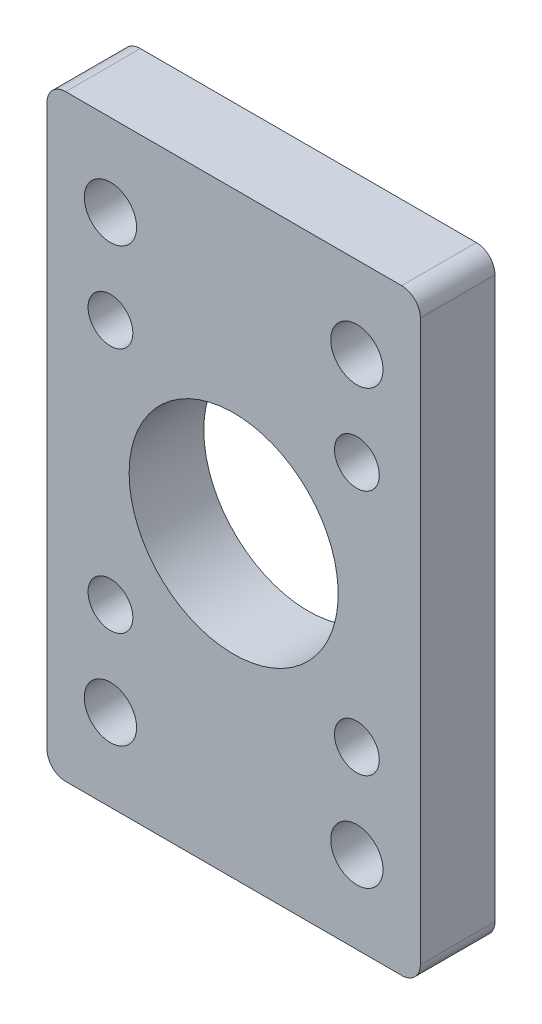
ISO-10303-21;
HEADER;
FILE_DESCRIPTION(('STEP AP214'),'2;1');
FILE_NAME('part.step','',(''),(''),'','','');
FILE_SCHEMA(('AUTOMOTIVE_DESIGN { 1 0 10303 214 1 1 1 1 }'));
ENDSEC;
DATA;
#1=APPLICATION_CONTEXT('core data for automotive mechanical design processes');
#2=APPLICATION_PROTOCOL_DEFINITION('international standard','automotive_design',2000,#1);
#3=PRODUCT_CONTEXT('',#1,'mechanical');
#4=PRODUCT('Part','Part','',(#3));
#5=PRODUCT_RELATED_PRODUCT_CATEGORY('part','',(#4));
#6=PRODUCT_DEFINITION_FORMATION('','',#4);
#7=PRODUCT_DEFINITION_CONTEXT('part definition',#1,'design');
#8=PRODUCT_DEFINITION('design','',#6,#7);
#9=PRODUCT_DEFINITION_SHAPE('','',#8);
#10=(LENGTH_UNIT() NAMED_UNIT(*) SI_UNIT(.MILLI.,.METRE.));
#11=(NAMED_UNIT(*) PLANE_ANGLE_UNIT() SI_UNIT($,.RADIAN.));
#12=(NAMED_UNIT(*) SI_UNIT($,.STERADIAN.) SOLID_ANGLE_UNIT());
#13=UNCERTAINTY_MEASURE_WITH_UNIT(LENGTH_MEASURE(1.E-05),#10,'distance_accuracy_value','');
#14=(GEOMETRIC_REPRESENTATION_CONTEXT(3) GLOBAL_UNCERTAINTY_ASSIGNED_CONTEXT((#13)) GLOBAL_UNIT_ASSIGNED_CONTEXT((#10,
#11,#12)) REPRESENTATION_CONTEXT('',''));
#15=CARTESIAN_POINT('',(0.,0.,0.));
#16=DIRECTION('',(0.,0.,1.));
#17=DIRECTION('',(1.,0.,0.));
#18=AXIS2_PLACEMENT_3D('',#15,#16,#17);
#19=CARTESIAN_POINT('',(-25.,40.,10.));
#20=DIRECTION('',(0.,0.,-1.));
#21=DIRECTION('',(-1.,0.,0.));
#22=AXIS2_PLACEMENT_3D('',#19,#20,#21);
#23=PLANE('',#22);
#24=CARTESIAN_POINT('',(0.,0.,10.));
#25=DIRECTION('',(0.,0.,-1.));
#26=DIRECTION('',(-1.,0.,0.));
#27=AXIS2_PLACEMENT_3D('',#24,#25,#26);
#28=CIRCLE('',#27,14.);
#29=CARTESIAN_POINT('',(-14.,0.,10.));
#30=VERTEX_POINT('',#29);
#31=EDGE_CURVE('E221',#30,#30,#28,.T.);
#32=ORIENTED_EDGE('',*,*,#31,.T.);
#33=EDGE_LOOP('',(#32));
#34=FACE_BOUND('',#33,.T.);
#35=CARTESIAN_POINT('',(-16.5,-29.,10.));
#36=DIRECTION('',(0.,0.,1.));
#37=DIRECTION('',(-1.,0.,0.));
#38=AXIS2_PLACEMENT_3D('',#35,#36,#37);
#39=CIRCLE('',#38,3.5);
#40=CARTESIAN_POINT('',(-20.,-29.,10.));
#41=VERTEX_POINT('',#40);
#42=EDGE_CURVE('E209',#41,#41,#39,.T.);
#43=ORIENTED_EDGE('',*,*,#42,.F.);
#44=EDGE_LOOP('',(#43));
#45=FACE_BOUND('',#44,.T.);
#46=CARTESIAN_POINT('',(16.5,-16.5,10.));
#47=DIRECTION('',(0.,0.,-1.));
#48=DIRECTION('',(1.,0.,0.));
#49=AXIS2_PLACEMENT_3D('',#46,#47,#48);
#50=CIRCLE('',#49,3.);
#51=CARTESIAN_POINT('',(19.5,-16.5,10.));
#52=VERTEX_POINT('',#51);
#53=EDGE_CURVE('E203',#52,#52,#50,.T.);
#54=ORIENTED_EDGE('',*,*,#53,.T.);
#55=EDGE_LOOP('',(#54));
#56=FACE_BOUND('',#55,.T.);
#57=CARTESIAN_POINT('',(16.5,-29.,10.));
#58=DIRECTION('',(0.,0.,-1.));
#59=DIRECTION('',(1.,0.,0.));
#60=AXIS2_PLACEMENT_3D('',#57,#58,#59);
#61=CIRCLE('',#60,3.5);
#62=CARTESIAN_POINT('',(20.,-29.,10.));
#63=VERTEX_POINT('',#62);
#64=EDGE_CURVE('E197',#63,#63,#61,.T.);
#65=ORIENTED_EDGE('',*,*,#64,.T.);
#66=EDGE_LOOP('',(#65));
#67=FACE_BOUND('',#66,.T.);
#68=CARTESIAN_POINT('',(16.5,29.,10.));
#69=DIRECTION('',(0.,0.,1.));
#70=DIRECTION('',(1.,0.,0.));
#71=AXIS2_PLACEMENT_3D('',#68,#69,#70);
#72=CIRCLE('',#71,3.5);
#73=CARTESIAN_POINT('',(20.,29.,10.));
#74=VERTEX_POINT('',#73);
#75=EDGE_CURVE('E185',#74,#74,#72,.T.);
#76=ORIENTED_EDGE('',*,*,#75,.F.);
#77=EDGE_LOOP('',(#76));
#78=FACE_BOUND('',#77,.T.);
#79=CARTESIAN_POINT('',(-16.5,16.5,10.));
#80=DIRECTION('',(0.,0.,-1.));
#81=DIRECTION('',(-1.,0.,0.));
#82=AXIS2_PLACEMENT_3D('',#79,#80,#81);
#83=CIRCLE('',#82,3.);
#84=CARTESIAN_POINT('',(-19.5,16.5,10.));
#85=VERTEX_POINT('',#84);
#86=EDGE_CURVE('E180',#85,#85,#83,.T.);
#87=ORIENTED_EDGE('',*,*,#86,.T.);
#88=EDGE_LOOP('',(#87));
#89=FACE_BOUND('',#88,.T.);
#90=CARTESIAN_POINT('',(-16.5,29.,10.));
#91=DIRECTION('',(0.,0.,-1.));
#92=DIRECTION('',(-1.,0.,0.));
#93=AXIS2_PLACEMENT_3D('',#90,#91,#92);
#94=CIRCLE('',#93,3.5);
#95=CARTESIAN_POINT('',(-20.,29.,10.));
#96=VERTEX_POINT('',#95);
#97=EDGE_CURVE('E175',#96,#96,#94,.T.);
#98=ORIENTED_EDGE('',*,*,#97,.T.);
#99=EDGE_LOOP('',(#98));
#100=FACE_BOUND('',#99,.T.);
#101=DIRECTION('',(1.,0.,0.));
#102=VECTOR('',#101,1.);
#103=CARTESIAN_POINT('',(-25.,-40.,10.));
#104=LINE('',#103,#102);
#105=CARTESIAN_POINT('',(-22.5,-40.,10.));
#106=VERTEX_POINT('',#105);
#107=CARTESIAN_POINT('',(22.5,-40.,10.));
#108=VERTEX_POINT('',#107);
#109=EDGE_CURVE('E166',#106,#108,#104,.T.);
#110=ORIENTED_EDGE('',*,*,#109,.T.);
#111=CARTESIAN_POINT('',(22.5,-37.5,10.));
#112=DIRECTION('',(0.,0.,-1.));
#113=DIRECTION('',(-1.,0.,0.));
#114=AXIS2_PLACEMENT_3D('',#111,#112,#113);
#115=CIRCLE('',#114,2.5);
#116=CARTESIAN_POINT('',(25.,-37.5,10.));
#117=VERTEX_POINT('',#116);
#118=EDGE_CURVE('E144',#108,#117,#115,.F.);
#119=ORIENTED_EDGE('',*,*,#118,.T.);
#120=DIRECTION('',(0.,1.,0.));
#121=VECTOR('',#120,1.);
#122=CARTESIAN_POINT('',(25.,-40.,10.));
#123=LINE('',#122,#121);
#124=CARTESIAN_POINT('',(25.,37.5,10.));
#125=VERTEX_POINT('',#124);
#126=EDGE_CURVE('E114',#117,#125,#123,.T.);
#127=ORIENTED_EDGE('',*,*,#126,.T.);
#128=CARTESIAN_POINT('',(22.5,37.5,10.));
#129=DIRECTION('',(0.,0.,-1.));
#130=DIRECTION('',(-1.,0.,0.));
#131=AXIS2_PLACEMENT_3D('',#128,#129,#130);
#132=CIRCLE('',#131,2.5);
#133=CARTESIAN_POINT('',(22.5,40.,10.));
#134=VERTEX_POINT('',#133);
#135=EDGE_CURVE('E50',#125,#134,#132,.F.);
#136=ORIENTED_EDGE('',*,*,#135,.T.);
#137=DIRECTION('',(-1.,0.,0.));
#138=VECTOR('',#137,1.);
#139=CARTESIAN_POINT('',(-25.,40.,10.));
#140=LINE('',#139,#138);
#141=CARTESIAN_POINT('',(-22.5,40.,10.));
#142=VERTEX_POINT('',#141);
#143=EDGE_CURVE('E130',#134,#142,#140,.T.);
#144=ORIENTED_EDGE('',*,*,#143,.T.);
#145=CARTESIAN_POINT('',(-22.5,37.5,10.));
#146=DIRECTION('',(0.,0.,-1.));
#147=DIRECTION('',(-1.,0.,0.));
#148=AXIS2_PLACEMENT_3D('',#145,#146,#147);
#149=CIRCLE('',#148,2.5);
#150=CARTESIAN_POINT('',(-25.,37.5,10.));
#151=VERTEX_POINT('',#150);
#152=EDGE_CURVE('E140',#142,#151,#149,.F.);
#153=ORIENTED_EDGE('',*,*,#152,.T.);
#154=DIRECTION('',(0.,-1.,0.));
#155=VECTOR('',#154,1.);
#156=CARTESIAN_POINT('',(-25.,-40.,10.));
#157=LINE('',#156,#155);
#158=CARTESIAN_POINT('',(-25.,-37.5,10.));
#159=VERTEX_POINT('',#158);
#160=EDGE_CURVE('E124',#151,#159,#157,.T.);
#161=ORIENTED_EDGE('',*,*,#160,.T.);
#162=CARTESIAN_POINT('',(-22.5,-37.5,10.));
#163=DIRECTION('',(0.,0.,-1.));
#164=DIRECTION('',(-1.,0.,0.));
#165=AXIS2_PLACEMENT_3D('',#162,#163,#164);
#166=CIRCLE('',#165,2.5);
#167=EDGE_CURVE('E142',#159,#106,#166,.F.);
#168=ORIENTED_EDGE('',*,*,#167,.T.);
#169=EDGE_LOOP('',(#110,#119,#127,#136,#144,#153,#161,#168));
#170=FACE_BOUND('',#169,.T.);
#171=CARTESIAN_POINT('',(16.5,16.5,10.));
#172=DIRECTION('',(0.,0.,1.));
#173=DIRECTION('',(1.,0.,0.));
#174=AXIS2_PLACEMENT_3D('',#171,#172,#173);
#175=CIRCLE('',#174,3.);
#176=CARTESIAN_POINT('',(19.5,16.5,10.));
#177=VERTEX_POINT('',#176);
#178=EDGE_CURVE('E191',#177,#177,#175,.T.);
#179=ORIENTED_EDGE('',*,*,#178,.F.);
#180=EDGE_LOOP('',(#179));
#181=FACE_BOUND('',#180,.T.);
#182=CARTESIAN_POINT('',(-16.5,-16.5,10.));
#183=DIRECTION('',(0.,0.,1.));
#184=DIRECTION('',(-1.,0.,0.));
#185=AXIS2_PLACEMENT_3D('',#182,#183,#184);
#186=CIRCLE('',#185,3.);
#187=CARTESIAN_POINT('',(-19.5,-16.5,10.));
#188=VERTEX_POINT('',#187);
#189=EDGE_CURVE('E215',#188,#188,#186,.T.);
#190=ORIENTED_EDGE('',*,*,#189,.F.);
#191=EDGE_LOOP('',(#190));
#192=FACE_BOUND('',#191,.T.);
#193=ADVANCED_FACE('F30',(#34,#45,#56,#67,#78,#89,#100,#170,#181,#192),#23,.F.);
#194=CARTESIAN_POINT('',(-25.,40.,0.));
#195=DIRECTION('',(0.,0.,-1.));
#196=DIRECTION('',(-1.,0.,0.));
#197=AXIS2_PLACEMENT_3D('',#194,#195,#196);
#198=PLANE('',#197);
#199=CARTESIAN_POINT('',(0.,0.,0.));
#200=DIRECTION('',(0.,0.,-1.));
#201=DIRECTION('',(-1.,0.,0.));
#202=AXIS2_PLACEMENT_3D('',#199,#200,#201);
#203=CIRCLE('',#202,14.);
#204=CARTESIAN_POINT('',(-14.,0.,0.));
#205=VERTEX_POINT('',#204);
#206=EDGE_CURVE('E224',#205,#205,#203,.T.);
#207=ORIENTED_EDGE('',*,*,#206,.F.);
#208=EDGE_LOOP('',(#207));
#209=FACE_BOUND('',#208,.T.);
#210=CARTESIAN_POINT('',(-16.5,-29.,0.));
#211=DIRECTION('',(0.,0.,1.));
#212=DIRECTION('',(-1.,0.,0.));
#213=AXIS2_PLACEMENT_3D('',#210,#211,#212);
#214=CIRCLE('',#213,3.5);
#215=CARTESIAN_POINT('',(-20.,-29.,0.));
#216=VERTEX_POINT('',#215);
#217=EDGE_CURVE('E212',#216,#216,#214,.T.);
#218=ORIENTED_EDGE('',*,*,#217,.T.);
#219=EDGE_LOOP('',(#218));
#220=FACE_BOUND('',#219,.T.);
#221=CARTESIAN_POINT('',(16.5,-16.5,0.));
#222=DIRECTION('',(0.,0.,-1.));
#223=DIRECTION('',(1.,0.,0.));
#224=AXIS2_PLACEMENT_3D('',#221,#222,#223);
#225=CIRCLE('',#224,3.);
#226=CARTESIAN_POINT('',(19.5,-16.5,0.));
#227=VERTEX_POINT('',#226);
#228=EDGE_CURVE('E206',#227,#227,#225,.T.);
#229=ORIENTED_EDGE('',*,*,#228,.F.);
#230=EDGE_LOOP('',(#229));
#231=FACE_BOUND('',#230,.T.);
#232=CARTESIAN_POINT('',(16.5,-29.,0.));
#233=DIRECTION('',(0.,0.,-1.));
#234=DIRECTION('',(1.,0.,0.));
#235=AXIS2_PLACEMENT_3D('',#232,#233,#234);
#236=CIRCLE('',#235,3.5);
#237=CARTESIAN_POINT('',(20.,-29.,0.));
#238=VERTEX_POINT('',#237);
#239=EDGE_CURVE('E200',#238,#238,#236,.T.);
#240=ORIENTED_EDGE('',*,*,#239,.F.);
#241=EDGE_LOOP('',(#240));
#242=FACE_BOUND('',#241,.T.);
#243=CARTESIAN_POINT('',(16.5,29.,0.));
#244=DIRECTION('',(0.,0.,1.));
#245=DIRECTION('',(1.,0.,0.));
#246=AXIS2_PLACEMENT_3D('',#243,#244,#245);
#247=CIRCLE('',#246,3.5);
#248=CARTESIAN_POINT('',(20.,29.,0.));
#249=VERTEX_POINT('',#248);
#250=EDGE_CURVE('E188',#249,#249,#247,.T.);
#251=ORIENTED_EDGE('',*,*,#250,.T.);
#252=EDGE_LOOP('',(#251));
#253=FACE_BOUND('',#252,.T.);
#254=CARTESIAN_POINT('',(-16.5,16.5,0.));
#255=DIRECTION('',(0.,0.,-1.));
#256=DIRECTION('',(-1.,0.,0.));
#257=AXIS2_PLACEMENT_3D('',#254,#255,#256);
#258=CIRCLE('',#257,3.);
#259=CARTESIAN_POINT('',(-19.5,16.5,0.));
#260=VERTEX_POINT('',#259);
#261=EDGE_CURVE('E182',#260,#260,#258,.T.);
#262=ORIENTED_EDGE('',*,*,#261,.F.);
#263=EDGE_LOOP('',(#262));
#264=FACE_BOUND('',#263,.T.);
#265=CARTESIAN_POINT('',(-16.5,29.,0.));
#266=DIRECTION('',(0.,0.,-1.));
#267=DIRECTION('',(-1.,0.,0.));
#268=AXIS2_PLACEMENT_3D('',#265,#266,#267);
#269=CIRCLE('',#268,3.5);
#270=CARTESIAN_POINT('',(-20.,29.,0.));
#271=VERTEX_POINT('',#270);
#272=EDGE_CURVE('E171',#271,#271,#269,.T.);
#273=ORIENTED_EDGE('',*,*,#272,.F.);
#274=EDGE_LOOP('',(#273));
#275=FACE_BOUND('',#274,.T.);
#276=DIRECTION('',(0.,1.,0.));
#277=VECTOR('',#276,1.);
#278=CARTESIAN_POINT('',(25.,-40.,0.));
#279=LINE('',#278,#277);
#280=CARTESIAN_POINT('',(25.,-37.5,0.));
#281=VERTEX_POINT('',#280);
#282=CARTESIAN_POINT('',(25.,37.5,0.));
#283=VERTEX_POINT('',#282);
#284=EDGE_CURVE('E112',#281,#283,#279,.T.);
#285=ORIENTED_EDGE('',*,*,#284,.F.);
#286=CARTESIAN_POINT('',(22.5,-37.5,0.));
#287=DIRECTION('',(0.,0.,-1.));
#288=DIRECTION('',(-1.,0.,0.));
#289=AXIS2_PLACEMENT_3D('',#286,#287,#288);
#290=CIRCLE('',#289,2.5);
#291=CARTESIAN_POINT('',(22.5,-40.,0.));
#292=VERTEX_POINT('',#291);
#293=EDGE_CURVE('E95',#281,#292,#290,.T.);
#294=ORIENTED_EDGE('',*,*,#293,.T.);
#295=DIRECTION('',(1.,0.,0.));
#296=VECTOR('',#295,1.);
#297=CARTESIAN_POINT('',(-25.,-40.,0.));
#298=LINE('',#297,#296);
#299=CARTESIAN_POINT('',(-22.5,-40.,0.));
#300=VERTEX_POINT('',#299);
#301=EDGE_CURVE('E122',#300,#292,#298,.T.);
#302=ORIENTED_EDGE('',*,*,#301,.F.);
#303=CARTESIAN_POINT('',(-22.5,-37.5,0.));
#304=DIRECTION('',(0.,0.,-1.));
#305=DIRECTION('',(-1.,0.,0.));
#306=AXIS2_PLACEMENT_3D('',#303,#304,#305);
#307=CIRCLE('',#306,2.5);
#308=CARTESIAN_POINT('',(-25.,-37.5,0.));
#309=VERTEX_POINT('',#308);
#310=EDGE_CURVE('E106',#300,#309,#307,.T.);
#311=ORIENTED_EDGE('',*,*,#310,.T.);
#312=DIRECTION('',(0.,-1.,0.));
#313=VECTOR('',#312,1.);
#314=CARTESIAN_POINT('',(-25.,-40.,0.));
#315=LINE('',#314,#313);
#316=CARTESIAN_POINT('',(-25.,37.5,0.));
#317=VERTEX_POINT('',#316);
#318=EDGE_CURVE('E126',#317,#309,#315,.T.);
#319=ORIENTED_EDGE('',*,*,#318,.F.);
#320=CARTESIAN_POINT('',(-22.5,37.5,0.));
#321=DIRECTION('',(0.,0.,-1.));
#322=DIRECTION('',(-1.,0.,0.));
#323=AXIS2_PLACEMENT_3D('',#320,#321,#322);
#324=CIRCLE('',#323,2.5);
#325=CARTESIAN_POINT('',(-22.5,40.,0.));
#326=VERTEX_POINT('',#325);
#327=EDGE_CURVE('E133',#317,#326,#324,.T.);
#328=ORIENTED_EDGE('',*,*,#327,.T.);
#329=DIRECTION('',(-1.,0.,0.));
#330=VECTOR('',#329,1.);
#331=CARTESIAN_POINT('',(-25.,40.,0.));
#332=LINE('',#331,#330);
#333=CARTESIAN_POINT('',(22.5,40.,0.));
#334=VERTEX_POINT('',#333);
#335=EDGE_CURVE('E121',#334,#326,#332,.T.);
#336=ORIENTED_EDGE('',*,*,#335,.F.);
#337=CARTESIAN_POINT('',(22.5,37.5,0.));
#338=DIRECTION('',(0.,0.,-1.));
#339=DIRECTION('',(-1.,0.,0.));
#340=AXIS2_PLACEMENT_3D('',#337,#338,#339);
#341=CIRCLE('',#340,2.5);
#342=EDGE_CURVE('E115',#334,#283,#341,.T.);
#343=ORIENTED_EDGE('',*,*,#342,.T.);
#344=EDGE_LOOP('',(#285,#294,#302,#311,#319,#328,#336,#343));
#345=FACE_BOUND('',#344,.T.);
#346=CARTESIAN_POINT('',(16.5,16.5,0.));
#347=DIRECTION('',(0.,0.,1.));
#348=DIRECTION('',(1.,0.,0.));
#349=AXIS2_PLACEMENT_3D('',#346,#347,#348);
#350=CIRCLE('',#349,3.);
#351=CARTESIAN_POINT('',(19.5,16.5,0.));
#352=VERTEX_POINT('',#351);
#353=EDGE_CURVE('E194',#352,#352,#350,.T.);
#354=ORIENTED_EDGE('',*,*,#353,.T.);
#355=EDGE_LOOP('',(#354));
#356=FACE_BOUND('',#355,.T.);
#357=CARTESIAN_POINT('',(-16.5,-16.5,0.));
#358=DIRECTION('',(0.,0.,1.));
#359=DIRECTION('',(-1.,0.,0.));
#360=AXIS2_PLACEMENT_3D('',#357,#358,#359);
#361=CIRCLE('',#360,3.);
#362=CARTESIAN_POINT('',(-19.5,-16.5,0.));
#363=VERTEX_POINT('',#362);
#364=EDGE_CURVE('E218',#363,#363,#361,.T.);
#365=ORIENTED_EDGE('',*,*,#364,.T.);
#366=EDGE_LOOP('',(#365));
#367=FACE_BOUND('',#366,.T.);
#368=ADVANCED_FACE('F118',(#209,#220,#231,#242,#253,#264,#275,#345,#356,#367),#198,.T.);
#369=CARTESIAN_POINT('',(-25.,-40.,10.));
#370=DIRECTION('',(1.,0.,0.));
#371=DIRECTION('',(0.,1.,0.));
#372=AXIS2_PLACEMENT_3D('',#369,#370,#371);
#373=PLANE('',#372);
#374=ORIENTED_EDGE('',*,*,#318,.T.);
#375=DIRECTION('',(0.,0.,-1.));
#376=VECTOR('',#375,1.);
#377=CARTESIAN_POINT('',(-25.,-37.5,10.));
#378=LINE('',#377,#376);
#379=EDGE_CURVE('E149',#309,#159,#378,.F.);
#380=ORIENTED_EDGE('',*,*,#379,.T.);
#381=ORIENTED_EDGE('',*,*,#160,.F.);
#382=DIRECTION('',(0.,0.,-1.));
#383=VECTOR('',#382,1.);
#384=CARTESIAN_POINT('',(-25.,37.5,10.));
#385=LINE('',#384,#383);
#386=EDGE_CURVE('E146',#151,#317,#385,.T.);
#387=ORIENTED_EDGE('',*,*,#386,.T.);
#388=EDGE_LOOP('',(#374,#380,#381,#387));
#389=FACE_BOUND('',#388,.T.);
#390=ADVANCED_FACE('F162',(#389),#373,.F.);
#391=CARTESIAN_POINT('',(-25.,-40.,10.));
#392=DIRECTION('',(0.,1.,0.));
#393=DIRECTION('',(0.,0.,1.));
#394=AXIS2_PLACEMENT_3D('',#391,#392,#393);
#395=PLANE('',#394);
#396=ORIENTED_EDGE('',*,*,#301,.T.);
#397=DIRECTION('',(0.,0.,-1.));
#398=VECTOR('',#397,1.);
#399=CARTESIAN_POINT('',(22.5,-40.,10.));
#400=LINE('',#399,#398);
#401=EDGE_CURVE('E100',#292,#108,#400,.F.);
#402=ORIENTED_EDGE('',*,*,#401,.T.);
#403=ORIENTED_EDGE('',*,*,#109,.F.);
#404=DIRECTION('',(0.,0.,-1.));
#405=VECTOR('',#404,1.);
#406=CARTESIAN_POINT('',(-22.5,-40.,10.));
#407=LINE('',#406,#405);
#408=EDGE_CURVE('E105',#106,#300,#407,.T.);
#409=ORIENTED_EDGE('',*,*,#408,.T.);
#410=EDGE_LOOP('',(#396,#402,#403,#409));
#411=FACE_BOUND('',#410,.T.);
#412=ADVANCED_FACE('F274',(#411),#395,.F.);
#413=CARTESIAN_POINT('',(25.,-40.,10.));
#414=DIRECTION('',(-1.,0.,0.));
#415=DIRECTION('',(0.,-1.,0.));
#416=AXIS2_PLACEMENT_3D('',#413,#414,#415);
#417=PLANE('',#416);
#418=ORIENTED_EDGE('',*,*,#126,.F.);
#419=DIRECTION('',(0.,0.,-1.));
#420=VECTOR('',#419,1.);
#421=CARTESIAN_POINT('',(25.,-37.5,10.));
#422=LINE('',#421,#420);
#423=EDGE_CURVE('E99',#117,#281,#422,.T.);
#424=ORIENTED_EDGE('',*,*,#423,.T.);
#425=ORIENTED_EDGE('',*,*,#284,.T.);
#426=DIRECTION('',(0.,0.,-1.));
#427=VECTOR('',#426,1.);
#428=CARTESIAN_POINT('',(25.,37.5,10.));
#429=LINE('',#428,#427);
#430=EDGE_CURVE('E116',#283,#125,#429,.F.);
#431=ORIENTED_EDGE('',*,*,#430,.T.);
#432=EDGE_LOOP('',(#418,#424,#425,#431));
#433=FACE_BOUND('',#432,.T.);
#434=ADVANCED_FACE('F111',(#433),#417,.F.);
#435=CARTESIAN_POINT('',(-25.,40.,10.));
#436=DIRECTION('',(0.,-1.,0.));
#437=DIRECTION('',(0.,0.,-1.));
#438=AXIS2_PLACEMENT_3D('',#435,#436,#437);
#439=PLANE('',#438);
#440=ORIENTED_EDGE('',*,*,#335,.T.);
#441=DIRECTION('',(0.,0.,-1.));
#442=VECTOR('',#441,1.);
#443=CARTESIAN_POINT('',(-22.5,40.,10.));
#444=LINE('',#443,#442);
#445=EDGE_CURVE('E11',#326,#142,#444,.F.);
#446=ORIENTED_EDGE('',*,*,#445,.T.);
#447=ORIENTED_EDGE('',*,*,#143,.F.);
#448=DIRECTION('',(0.,0.,-1.));
#449=VECTOR('',#448,1.);
#450=CARTESIAN_POINT('',(22.5,40.,10.));
#451=LINE('',#450,#449);
#452=EDGE_CURVE('E38',#134,#334,#451,.T.);
#453=ORIENTED_EDGE('',*,*,#452,.T.);
#454=EDGE_LOOP('',(#440,#446,#447,#453));
#455=FACE_BOUND('',#454,.T.);
#456=ADVANCED_FACE('F152',(#455),#439,.F.);
#457=CARTESIAN_POINT('',(-16.5,29.,10.));
#458=DIRECTION('',(0.,0.,-1.));
#459=DIRECTION('',(-1.,0.,0.));
#460=AXIS2_PLACEMENT_3D('',#457,#458,#459);
#461=CYLINDRICAL_SURFACE('',#460,3.5);
#462=ORIENTED_EDGE('',*,*,#97,.F.);
#463=EDGE_LOOP('',(#462));
#464=FACE_BOUND('',#463,.T.);
#465=ORIENTED_EDGE('',*,*,#272,.T.);
#466=EDGE_LOOP('',(#465));
#467=FACE_BOUND('',#466,.T.);
#468=ADVANCED_FACE('F254',(#464,#467),#461,.F.);
#469=CARTESIAN_POINT('',(-16.5,16.5,10.));
#470=DIRECTION('',(0.,0.,-1.));
#471=DIRECTION('',(-1.,0.,0.));
#472=AXIS2_PLACEMENT_3D('',#469,#470,#471);
#473=CYLINDRICAL_SURFACE('',#472,3.);
#474=ORIENTED_EDGE('',*,*,#86,.F.);
#475=EDGE_LOOP('',(#474));
#476=FACE_BOUND('',#475,.T.);
#477=ORIENTED_EDGE('',*,*,#261,.T.);
#478=EDGE_LOOP('',(#477));
#479=FACE_BOUND('',#478,.T.);
#480=ADVANCED_FACE('F256',(#476,#479),#473,.F.);
#481=CARTESIAN_POINT('',(16.5,29.,10.));
#482=DIRECTION('',(0.,0.,-1.));
#483=DIRECTION('',(-1.,0.,0.));
#484=AXIS2_PLACEMENT_3D('',#481,#482,#483);
#485=CYLINDRICAL_SURFACE('',#484,3.5);
#486=ORIENTED_EDGE('',*,*,#75,.T.);
#487=EDGE_LOOP('',(#486));
#488=FACE_BOUND('',#487,.T.);
#489=ORIENTED_EDGE('',*,*,#250,.F.);
#490=EDGE_LOOP('',(#489));
#491=FACE_BOUND('',#490,.T.);
#492=ADVANCED_FACE('F263',(#488,#491),#485,.F.);
#493=CARTESIAN_POINT('',(16.5,16.5,10.));
#494=DIRECTION('',(0.,0.,-1.));
#495=DIRECTION('',(-1.,0.,0.));
#496=AXIS2_PLACEMENT_3D('',#493,#494,#495);
#497=CYLINDRICAL_SURFACE('',#496,3.);
#498=ORIENTED_EDGE('',*,*,#178,.T.);
#499=EDGE_LOOP('',(#498));
#500=FACE_BOUND('',#499,.T.);
#501=ORIENTED_EDGE('',*,*,#353,.F.);
#502=EDGE_LOOP('',(#501));
#503=FACE_BOUND('',#502,.T.);
#504=ADVANCED_FACE('F317',(#500,#503),#497,.F.);
#505=CARTESIAN_POINT('',(16.5,-29.,10.));
#506=DIRECTION('',(0.,0.,-1.));
#507=DIRECTION('',(-1.,0.,0.));
#508=AXIS2_PLACEMENT_3D('',#505,#506,#507);
#509=CYLINDRICAL_SURFACE('',#508,3.5);
#510=ORIENTED_EDGE('',*,*,#64,.F.);
#511=EDGE_LOOP('',(#510));
#512=FACE_BOUND('',#511,.T.);
#513=ORIENTED_EDGE('',*,*,#239,.T.);
#514=EDGE_LOOP('',(#513));
#515=FACE_BOUND('',#514,.T.);
#516=ADVANCED_FACE('F313',(#512,#515),#509,.F.);
#517=CARTESIAN_POINT('',(16.5,-16.5,10.));
#518=DIRECTION('',(0.,0.,-1.));
#519=DIRECTION('',(-1.,0.,0.));
#520=AXIS2_PLACEMENT_3D('',#517,#518,#519);
#521=CYLINDRICAL_SURFACE('',#520,3.);
#522=ORIENTED_EDGE('',*,*,#53,.F.);
#523=EDGE_LOOP('',(#522));
#524=FACE_BOUND('',#523,.T.);
#525=ORIENTED_EDGE('',*,*,#228,.T.);
#526=EDGE_LOOP('',(#525));
#527=FACE_BOUND('',#526,.T.);
#528=ADVANCED_FACE('F307',(#524,#527),#521,.F.);
#529=CARTESIAN_POINT('',(-16.5,-29.,10.));
#530=DIRECTION('',(0.,0.,-1.));
#531=DIRECTION('',(-1.,0.,0.));
#532=AXIS2_PLACEMENT_3D('',#529,#530,#531);
#533=CYLINDRICAL_SURFACE('',#532,3.5);
#534=ORIENTED_EDGE('',*,*,#42,.T.);
#535=EDGE_LOOP('',(#534));
#536=FACE_BOUND('',#535,.T.);
#537=ORIENTED_EDGE('',*,*,#217,.F.);
#538=EDGE_LOOP('',(#537));
#539=FACE_BOUND('',#538,.T.);
#540=ADVANCED_FACE('F300',(#536,#539),#533,.F.);
#541=CARTESIAN_POINT('',(-16.5,-16.5,10.));
#542=DIRECTION('',(0.,0.,-1.));
#543=DIRECTION('',(-1.,0.,0.));
#544=AXIS2_PLACEMENT_3D('',#541,#542,#543);
#545=CYLINDRICAL_SURFACE('',#544,3.);
#546=ORIENTED_EDGE('',*,*,#189,.T.);
#547=EDGE_LOOP('',(#546));
#548=FACE_BOUND('',#547,.T.);
#549=ORIENTED_EDGE('',*,*,#364,.F.);
#550=EDGE_LOOP('',(#549));
#551=FACE_BOUND('',#550,.T.);
#552=ADVANCED_FACE('F235',(#548,#551),#545,.F.);
#553=CARTESIAN_POINT('',(0.,0.,10.));
#554=DIRECTION('',(0.,0.,-1.));
#555=DIRECTION('',(-1.,0.,0.));
#556=AXIS2_PLACEMENT_3D('',#553,#554,#555);
#557=CYLINDRICAL_SURFACE('',#556,14.);
#558=ORIENTED_EDGE('',*,*,#31,.F.);
#559=EDGE_LOOP('',(#558));
#560=FACE_BOUND('',#559,.T.);
#561=ORIENTED_EDGE('',*,*,#206,.T.);
#562=EDGE_LOOP('',(#561));
#563=FACE_BOUND('',#562,.T.);
#564=ADVANCED_FACE('F232',(#560,#563),#557,.F.);
#565=CARTESIAN_POINT('',(22.5,-37.5,10.));
#566=DIRECTION('',(0.,0.,-1.));
#567=DIRECTION('',(-1.,0.,0.));
#568=AXIS2_PLACEMENT_3D('',#565,#566,#567);
#569=CYLINDRICAL_SURFACE('',#568,2.5);
#570=ORIENTED_EDGE('',*,*,#118,.F.);
#571=ORIENTED_EDGE('',*,*,#401,.F.);
#572=ORIENTED_EDGE('',*,*,#293,.F.);
#573=ORIENTED_EDGE('',*,*,#423,.F.);
#574=EDGE_LOOP('',(#570,#571,#572,#573));
#575=FACE_BOUND('',#574,.T.);
#576=ADVANCED_FACE('F98',(#575),#569,.T.);
#577=CARTESIAN_POINT('',(-22.5,-37.5,10.));
#578=DIRECTION('',(0.,0.,-1.));
#579=DIRECTION('',(-1.,0.,0.));
#580=AXIS2_PLACEMENT_3D('',#577,#578,#579);
#581=CYLINDRICAL_SURFACE('',#580,2.5);
#582=ORIENTED_EDGE('',*,*,#167,.F.);
#583=ORIENTED_EDGE('',*,*,#379,.F.);
#584=ORIENTED_EDGE('',*,*,#310,.F.);
#585=ORIENTED_EDGE('',*,*,#408,.F.);
#586=EDGE_LOOP('',(#582,#583,#584,#585));
#587=FACE_BOUND('',#586,.T.);
#588=ADVANCED_FACE('F282',(#587),#581,.T.);
#589=CARTESIAN_POINT('',(-22.5,37.5,10.));
#590=DIRECTION('',(0.,0.,-1.));
#591=DIRECTION('',(-1.,0.,0.));
#592=AXIS2_PLACEMENT_3D('',#589,#590,#591);
#593=CYLINDRICAL_SURFACE('',#592,2.5);
#594=ORIENTED_EDGE('',*,*,#152,.F.);
#595=ORIENTED_EDGE('',*,*,#445,.F.);
#596=ORIENTED_EDGE('',*,*,#327,.F.);
#597=ORIENTED_EDGE('',*,*,#386,.F.);
#598=EDGE_LOOP('',(#594,#595,#596,#597));
#599=FACE_BOUND('',#598,.T.);
#600=ADVANCED_FACE('F159',(#599),#593,.T.);
#601=CARTESIAN_POINT('',(22.5,37.5,10.));
#602=DIRECTION('',(0.,0.,-1.));
#603=DIRECTION('',(-1.,0.,0.));
#604=AXIS2_PLACEMENT_3D('',#601,#602,#603);
#605=CYLINDRICAL_SURFACE('',#604,2.5);
#606=ORIENTED_EDGE('',*,*,#135,.F.);
#607=ORIENTED_EDGE('',*,*,#430,.F.);
#608=ORIENTED_EDGE('',*,*,#342,.F.);
#609=ORIENTED_EDGE('',*,*,#452,.F.);
#610=EDGE_LOOP('',(#606,#607,#608,#609));
#611=FACE_BOUND('',#610,.T.);
#612=ADVANCED_FACE('F32',(#611),#605,.T.);
#613=CLOSED_SHELL('',(#193,#368,#390,#412,#434,#456,#468,#480,#492,#504,#516,#528,#540,#552,
#564,#576,#588,#600,#612));
#614=MANIFOLD_SOLID_BREP('B2',#613);
#615=ADVANCED_BREP_SHAPE_REPRESENTATION('',(#18,#614),#14);
#616=SHAPE_DEFINITION_REPRESENTATION(#9,#615);
ENDSEC;
END-ISO-10303-21;
